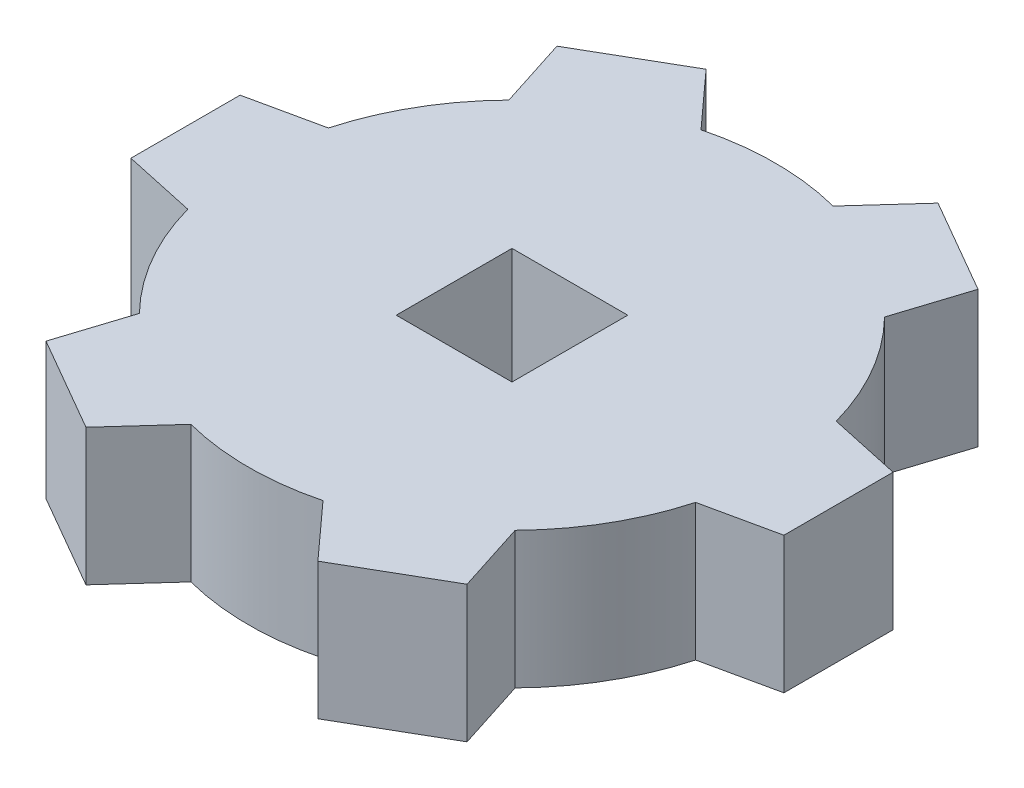
ISO-10303-21;
HEADER;
FILE_DESCRIPTION(('STEP AP214'),'2;1');
FILE_NAME('part.step','',(''),(''),'','','');
FILE_SCHEMA(('AUTOMOTIVE_DESIGN { 1 0 10303 214 1 1 1 1 }'));
ENDSEC;
DATA;
#1=APPLICATION_CONTEXT('core data for automotive mechanical design processes');
#2=APPLICATION_PROTOCOL_DEFINITION('international standard','automotive_design',2000,#1);
#3=PRODUCT_CONTEXT('',#1,'mechanical');
#4=PRODUCT('Part','Part','',(#3));
#5=PRODUCT_RELATED_PRODUCT_CATEGORY('part','',(#4));
#6=PRODUCT_DEFINITION_FORMATION('','',#4);
#7=PRODUCT_DEFINITION_CONTEXT('part definition',#1,'design');
#8=PRODUCT_DEFINITION('design','',#6,#7);
#9=PRODUCT_DEFINITION_SHAPE('','',#8);
#10=(LENGTH_UNIT() NAMED_UNIT(*) SI_UNIT(.MILLI.,.METRE.));
#11=(NAMED_UNIT(*) PLANE_ANGLE_UNIT() SI_UNIT($,.RADIAN.));
#12=(NAMED_UNIT(*) SI_UNIT($,.STERADIAN.) SOLID_ANGLE_UNIT());
#13=UNCERTAINTY_MEASURE_WITH_UNIT(LENGTH_MEASURE(1.E-05),#10,'distance_accuracy_value','');
#14=(GEOMETRIC_REPRESENTATION_CONTEXT(3) GLOBAL_UNCERTAINTY_ASSIGNED_CONTEXT((#13)) GLOBAL_UNIT_ASSIGNED_CONTEXT((#10,
#11,#12)) REPRESENTATION_CONTEXT('',''));
#15=CARTESIAN_POINT('',(0.,0.,0.));
#16=DIRECTION('',(0.,0.,1.));
#17=DIRECTION('',(1.,0.,0.));
#18=AXIS2_PLACEMENT_3D('',#15,#16,#17);
#19=CARTESIAN_POINT('',(0.,5.,0.));
#20=DIRECTION('',(0.,1.,0.));
#21=DIRECTION('',(0.,0.,1.));
#22=AXIS2_PLACEMENT_3D('',#19,#20,#21);
#23=PLANE('',#22);
#24=DIRECTION('',(0.977350986085218,0.,-0.211624785878809));
#25=VECTOR('',#24,1.);
#26=CARTESIAN_POINT('',(9.65,5.,2.5));
#27=LINE('',#26,#25);
#28=CARTESIAN_POINT('',(9.29987594348419,5.,2.57581199543059));
#29=VERTEX_POINT('',#28);
#30=CARTESIAN_POINT('',(11.9591600117319,5.,2.));
#31=VERTEX_POINT('',#30);
#32=EDGE_CURVE('E256',#29,#31,#27,.T.);
#33=ORIENTED_EDGE('',*,*,#32,.T.);
#34=DIRECTION('',(0.,0.,-1.));
#35=VECTOR('',#34,1.);
#36=CARTESIAN_POINT('',(11.9591600117319,5.,-2.));
#37=LINE('',#36,#35);
#38=CARTESIAN_POINT('',(11.9591600117319,5.,-2.));
#39=VERTEX_POINT('',#38);
#40=EDGE_CURVE('E258',#31,#39,#37,.T.);
#41=ORIENTED_EDGE('',*,*,#40,.T.);
#42=DIRECTION('',(-0.977350986085224,0.,-0.21162478587878));
#43=VECTOR('',#42,1.);
#44=CARTESIAN_POINT('',(11.9591600117319,5.,-2.));
#45=LINE('',#44,#43);
#46=CARTESIAN_POINT('',(9.29987594348419,5.,-2.57581199543059));
#47=VERTEX_POINT('',#46);
#48=EDGE_CURVE('E261',#39,#47,#45,.T.);
#49=ORIENTED_EDGE('',*,*,#48,.T.);
#50=CARTESIAN_POINT('',(0.,5.,0.));
#51=DIRECTION('',(0.,1.,0.));
#52=DIRECTION('',(0.,0.,1.));
#53=AXIS2_PLACEMENT_3D('',#50,#51,#52);
#54=CIRCLE('',#53,9.65);
#55=CARTESIAN_POINT('',(6.88065659515767,5.,-6.76602282138579));
#56=VERTEX_POINT('',#55);
#57=EDGE_CURVE('E263',#47,#56,#54,.T.);
#58=ORIENTED_EDGE('',*,*,#57,.T.);
#59=DIRECTION('',(0.305403052401118,0.,-0.952223175302975));
#60=VECTOR('',#59,1.);
#61=CARTESIAN_POINT('',(6.99006350946109,5.,-7.10714514651984));
#62=LINE('',#61,#60);
#63=CARTESIAN_POINT('',(7.71163081343484,5.,-9.35693637808287));
#64=VERTEX_POINT('',#63);
#65=EDGE_CURVE('E265',#56,#64,#62,.T.);
#66=ORIENTED_EDGE('',*,*,#65,.T.);
#67=DIRECTION('',(-0.866025403784439,0.,-0.5));
#68=VECTOR('',#67,1.);
#69=CARTESIAN_POINT('',(4.24752919829708,5.,-11.3569363780829));
#70=LINE('',#69,#68);
#71=CARTESIAN_POINT('',(4.24752919829708,5.,-11.3569363780829));
#72=VERTEX_POINT('',#71);
#73=EDGE_CURVE('E267',#64,#72,#70,.T.);
#74=ORIENTED_EDGE('',*,*,#73,.T.);
#75=DIRECTION('',(-0.671947933684077,0.,0.740598389424187));
#76=VECTOR('',#75,1.);
#77=CARTESIAN_POINT('',(4.24752919829708,5.,-11.3569363780829));
#78=LINE('',#77,#76);
#79=CARTESIAN_POINT('',(2.4192193483265,5.,-9.34183481681638));
#80=VERTEX_POINT('',#79);
#81=EDGE_CURVE('E269',#72,#80,#78,.T.);
#82=ORIENTED_EDGE('',*,*,#81,.T.);
#83=CARTESIAN_POINT('',(0.,5.,0.));
#84=DIRECTION('',(0.,1.,0.));
#85=DIRECTION('',(0.,0.,1.));
#86=AXIS2_PLACEMENT_3D('',#83,#84,#85);
#87=CIRCLE('',#86,9.65);
#88=CARTESIAN_POINT('',(-2.41921934832651,5.,-9.34183481681637));
#89=VERTEX_POINT('',#88);
#90=EDGE_CURVE('E271',#80,#89,#87,.T.);
#91=ORIENTED_EDGE('',*,*,#90,.T.);
#92=DIRECTION('',(-0.6719479336841,0.,-0.740598389424166));
#93=VECTOR('',#92,1.);
#94=CARTESIAN_POINT('',(-2.65993649053891,5.,-9.60714514651983));
#95=LINE('',#94,#93);
#96=CARTESIAN_POINT('',(-4.2475291982971,5.,-11.3569363780829));
#97=VERTEX_POINT('',#96);
#98=EDGE_CURVE('E273',#89,#97,#95,.T.);
#99=ORIENTED_EDGE('',*,*,#98,.T.);
#100=DIRECTION('',(-0.866025403784438,0.,0.5));
#101=VECTOR('',#100,1.);
#102=CARTESIAN_POINT('',(-7.71163081343485,5.,-9.35693637808286));
#103=LINE('',#102,#101);
#104=CARTESIAN_POINT('',(-7.71163081343485,5.,-9.35693637808286));
#105=VERTEX_POINT('',#104);
#106=EDGE_CURVE('E275',#97,#105,#103,.T.);
#107=ORIENTED_EDGE('',*,*,#106,.T.);
#108=DIRECTION('',(0.305403052401147,0.,0.952223175302966));
#109=VECTOR('',#108,1.);
#110=CARTESIAN_POINT('',(-7.71163081343485,5.,-9.35693637808286));
#111=LINE('',#110,#109);
#112=CARTESIAN_POINT('',(-6.88065659515768,5.,-6.76602282138578));
#113=VERTEX_POINT('',#112);
#114=EDGE_CURVE('E277',#105,#113,#111,.T.);
#115=ORIENTED_EDGE('',*,*,#114,.T.);
#116=CARTESIAN_POINT('',(0.,5.,0.));
#117=DIRECTION('',(0.,1.,0.));
#118=DIRECTION('',(0.,0.,1.));
#119=AXIS2_PLACEMENT_3D('',#116,#117,#118);
#120=CIRCLE('',#119,9.65);
#121=CARTESIAN_POINT('',(-9.29987594348418,5.,-2.5758119954306));
#122=VERTEX_POINT('',#121);
#123=EDGE_CURVE('E279',#113,#122,#120,.T.);
#124=ORIENTED_EDGE('',*,*,#123,.T.);
#125=DIRECTION('',(-0.977350986085218,0.,0.211624785878809));
#126=VECTOR('',#125,1.);
#127=CARTESIAN_POINT('',(-9.65,5.,-2.5));
#128=LINE('',#127,#126);
#129=CARTESIAN_POINT('',(-11.9591600117319,5.,-2.));
#130=VERTEX_POINT('',#129);
#131=EDGE_CURVE('E281',#122,#130,#128,.T.);
#132=ORIENTED_EDGE('',*,*,#131,.T.);
#133=DIRECTION('',(0.,0.,1.));
#134=VECTOR('',#133,1.);
#135=CARTESIAN_POINT('',(-11.9591600117319,5.,2.));
#136=LINE('',#135,#134);
#137=CARTESIAN_POINT('',(-11.9591600117319,5.,2.));
#138=VERTEX_POINT('',#137);
#139=EDGE_CURVE('E283',#130,#138,#136,.T.);
#140=ORIENTED_EDGE('',*,*,#139,.T.);
#141=DIRECTION('',(0.977350986085224,0.,0.21162478587878));
#142=VECTOR('',#141,1.);
#143=CARTESIAN_POINT('',(-11.9591600117319,5.,2.));
#144=LINE('',#143,#142);
#145=CARTESIAN_POINT('',(-9.29987594348419,5.,2.5758119954306));
#146=VERTEX_POINT('',#145);
#147=EDGE_CURVE('E285',#138,#146,#144,.T.);
#148=ORIENTED_EDGE('',*,*,#147,.T.);
#149=CARTESIAN_POINT('',(0.,5.,0.));
#150=DIRECTION('',(0.,1.,0.));
#151=DIRECTION('',(0.,0.,1.));
#152=AXIS2_PLACEMENT_3D('',#149,#150,#151);
#153=CIRCLE('',#152,9.65);
#154=CARTESIAN_POINT('',(-6.88065659515768,5.,6.76602282138578));
#155=VERTEX_POINT('',#154);
#156=EDGE_CURVE('E287',#146,#155,#153,.T.);
#157=ORIENTED_EDGE('',*,*,#156,.T.);
#158=DIRECTION('',(-0.305403052401119,0.,0.952223175302975));
#159=VECTOR('',#158,1.);
#160=CARTESIAN_POINT('',(-6.9900635094611,5.,7.10714514651984));
#161=LINE('',#160,#159);
#162=CARTESIAN_POINT('',(-7.71163081343484,5.,9.35693637808287));
#163=VERTEX_POINT('',#162);
#164=EDGE_CURVE('E289',#155,#163,#161,.T.);
#165=ORIENTED_EDGE('',*,*,#164,.T.);
#166=DIRECTION('',(0.866025403784439,0.,0.5));
#167=VECTOR('',#166,1.);
#168=CARTESIAN_POINT('',(-4.24752919829709,5.,11.3569363780829));
#169=LINE('',#168,#167);
#170=CARTESIAN_POINT('',(-4.24752919829709,5.,11.3569363780829));
#171=VERTEX_POINT('',#170);
#172=EDGE_CURVE('E291',#163,#171,#169,.T.);
#173=ORIENTED_EDGE('',*,*,#172,.T.);
#174=DIRECTION('',(0.671947933684078,0.,-0.740598389424186));
#175=VECTOR('',#174,1.);
#176=CARTESIAN_POINT('',(-4.24752919829709,5.,11.3569363780829));
#177=LINE('',#176,#175);
#178=CARTESIAN_POINT('',(-2.41921934832651,5.,9.34183481681638));
#179=VERTEX_POINT('',#178);
#180=EDGE_CURVE('E293',#171,#179,#177,.T.);
#181=ORIENTED_EDGE('',*,*,#180,.T.);
#182=CARTESIAN_POINT('',(0.,5.,0.));
#183=DIRECTION('',(0.,1.,0.));
#184=DIRECTION('',(0.,0.,1.));
#185=AXIS2_PLACEMENT_3D('',#182,#183,#184);
#186=CIRCLE('',#185,9.65);
#187=CARTESIAN_POINT('',(2.41921934832651,5.,9.34183481681638));
#188=VERTEX_POINT('',#187);
#189=EDGE_CURVE('E295',#179,#188,#186,.T.);
#190=ORIENTED_EDGE('',*,*,#189,.T.);
#191=DIRECTION('',(0.671947933684103,0.,0.740598389424163));
#192=VECTOR('',#191,1.);
#193=CARTESIAN_POINT('',(2.6599364905389,5.,9.60714514651983));
#194=LINE('',#193,#192);
#195=CARTESIAN_POINT('',(4.24752919829709,5.,11.3569363780829));
#196=VERTEX_POINT('',#195);
#197=EDGE_CURVE('E297',#188,#196,#194,.T.);
#198=ORIENTED_EDGE('',*,*,#197,.T.);
#199=DIRECTION('',(0.866025403784438,0.,-0.5));
#200=VECTOR('',#199,1.);
#201=CARTESIAN_POINT('',(7.71163081343485,5.,9.35693637808286));
#202=LINE('',#201,#200);
#203=CARTESIAN_POINT('',(7.71163081343485,5.,9.35693637808286));
#204=VERTEX_POINT('',#203);
#205=EDGE_CURVE('E299',#196,#204,#202,.T.);
#206=ORIENTED_EDGE('',*,*,#205,.T.);
#207=DIRECTION('',(-0.305403052401147,0.,-0.952223175302966));
#208=VECTOR('',#207,1.);
#209=CARTESIAN_POINT('',(7.71163081343485,5.,9.35693637808286));
#210=LINE('',#209,#208);
#211=CARTESIAN_POINT('',(6.88065659515767,5.,6.76602282138578));
#212=VERTEX_POINT('',#211);
#213=EDGE_CURVE('E301',#204,#212,#210,.T.);
#214=ORIENTED_EDGE('',*,*,#213,.T.);
#215=CARTESIAN_POINT('',(0.,5.,0.));
#216=DIRECTION('',(0.,1.,0.));
#217=DIRECTION('',(0.,0.,1.));
#218=AXIS2_PLACEMENT_3D('',#215,#216,#217);
#219=CIRCLE('',#218,9.65);
#220=EDGE_CURVE('E303',#212,#29,#219,.T.);
#221=ORIENTED_EDGE('',*,*,#220,.T.);
#222=EDGE_LOOP('',(#33,#41,#49,#58,#66,#74,#82,#91,#99,#107,#115,#124,#132,#140,#148,#157,#165,
#173,#181,#190,#198,#206,#214,#221));
#223=FACE_BOUND('',#222,.T.);
#224=DIRECTION('',(1.,0.,0.));
#225=VECTOR('',#224,1.);
#226=CARTESIAN_POINT('',(2.12,5.,2.12));
#227=LINE('',#226,#225);
#228=CARTESIAN_POINT('',(-2.12,5.,2.12));
#229=VERTEX_POINT('',#228);
#230=CARTESIAN_POINT('',(2.12,5.,2.12));
#231=VERTEX_POINT('',#230);
#232=EDGE_CURVE('E228',#229,#231,#227,.T.);
#233=ORIENTED_EDGE('',*,*,#232,.F.);
#234=DIRECTION('',(0.,0.,1.));
#235=VECTOR('',#234,1.);
#236=CARTESIAN_POINT('',(-2.12,5.,-2.12));
#237=LINE('',#236,#235);
#238=CARTESIAN_POINT('',(-2.12,5.,-2.12));
#239=VERTEX_POINT('',#238);
#240=EDGE_CURVE('E220',#239,#229,#237,.T.);
#241=ORIENTED_EDGE('',*,*,#240,.F.);
#242=DIRECTION('',(-1.,0.,0.));
#243=VECTOR('',#242,1.);
#244=CARTESIAN_POINT('',(2.12,5.,-2.12));
#245=LINE('',#244,#243);
#246=CARTESIAN_POINT('',(2.12,5.,-2.12));
#247=VERTEX_POINT('',#246);
#248=EDGE_CURVE('E242',#247,#239,#245,.T.);
#249=ORIENTED_EDGE('',*,*,#248,.F.);
#250=DIRECTION('',(0.,0.,-1.));
#251=VECTOR('',#250,1.);
#252=CARTESIAN_POINT('',(2.12,5.,-2.12));
#253=LINE('',#252,#251);
#254=EDGE_CURVE('E240',#231,#247,#253,.T.);
#255=ORIENTED_EDGE('',*,*,#254,.F.);
#256=EDGE_LOOP('',(#233,#241,#249,#255));
#257=FACE_BOUND('',#256,.T.);
#258=ADVANCED_FACE('F35',(#223,#257),#23,.T.);
#259=CARTESIAN_POINT('',(0.,0.,0.));
#260=DIRECTION('',(0.,1.,0.));
#261=DIRECTION('',(0.,0.,1.));
#262=AXIS2_PLACEMENT_3D('',#259,#260,#261);
#263=PLANE('',#262);
#264=DIRECTION('',(0.977350986085224,0.,-0.21162478587878));
#265=VECTOR('',#264,1.);
#266=CARTESIAN_POINT('',(11.9591600117319,0.,2.));
#267=LINE('',#266,#265);
#268=CARTESIAN_POINT('',(9.29987594348419,0.,2.57581199543059));
#269=VERTEX_POINT('',#268);
#270=CARTESIAN_POINT('',(11.9591600117319,0.,2.));
#271=VERTEX_POINT('',#270);
#272=EDGE_CURVE('E236',#269,#271,#267,.T.);
#273=ORIENTED_EDGE('',*,*,#272,.F.);
#274=CARTESIAN_POINT('',(0.,0.,0.));
#275=DIRECTION('',(0.,1.,0.));
#276=DIRECTION('',(0.,0.,1.));
#277=AXIS2_PLACEMENT_3D('',#274,#275,#276);
#278=CIRCLE('',#277,9.65);
#279=CARTESIAN_POINT('',(6.88065659515767,0.,6.76602282138578));
#280=VERTEX_POINT('',#279);
#281=EDGE_CURVE('E259',#280,#269,#278,.T.);
#282=ORIENTED_EDGE('',*,*,#281,.F.);
#283=DIRECTION('',(-0.305403052401119,0.,-0.952223175302975));
#284=VECTOR('',#283,1.);
#285=CARTESIAN_POINT('',(6.9900635094611,0.,7.10714514651983));
#286=LINE('',#285,#284);
#287=CARTESIAN_POINT('',(7.71163081343485,0.,9.35693637808286));
#288=VERTEX_POINT('',#287);
#289=EDGE_CURVE('E360',#288,#280,#286,.T.);
#290=ORIENTED_EDGE('',*,*,#289,.F.);
#291=DIRECTION('',(0.866025403784438,0.,-0.5));
#292=VECTOR('',#291,1.);
#293=CARTESIAN_POINT('',(7.71163081343485,0.,9.35693637808286));
#294=LINE('',#293,#292);
#295=CARTESIAN_POINT('',(4.24752919829709,0.,11.3569363780829));
#296=VERTEX_POINT('',#295);
#297=EDGE_CURVE('E357',#296,#288,#294,.T.);
#298=ORIENTED_EDGE('',*,*,#297,.F.);
#299=DIRECTION('',(0.671947933684078,0.,0.740598389424186));
#300=VECTOR('',#299,1.);
#301=CARTESIAN_POINT('',(4.24752919829709,0.,11.3569363780829));
#302=LINE('',#301,#300);
#303=CARTESIAN_POINT('',(2.41921934832651,0.,9.34183481681638));
#304=VERTEX_POINT('',#303);
#305=EDGE_CURVE('E355',#304,#296,#302,.T.);
#306=ORIENTED_EDGE('',*,*,#305,.F.);
#307=CARTESIAN_POINT('',(0.,0.,0.));
#308=DIRECTION('',(0.,1.,0.));
#309=DIRECTION('',(0.,0.,1.));
#310=AXIS2_PLACEMENT_3D('',#307,#308,#309);
#311=CIRCLE('',#310,9.65);
#312=CARTESIAN_POINT('',(-2.41921934832651,0.,9.34183481681638));
#313=VERTEX_POINT('',#312);
#314=EDGE_CURVE('E352',#313,#304,#311,.T.);
#315=ORIENTED_EDGE('',*,*,#314,.F.);
#316=DIRECTION('',(0.6719479336841,0.,-0.740598389424166));
#317=VECTOR('',#316,1.);
#318=CARTESIAN_POINT('',(-2.6599364905389,0.,9.60714514651983));
#319=LINE('',#318,#317);
#320=CARTESIAN_POINT('',(-4.24752919829709,0.,11.3569363780829));
#321=VERTEX_POINT('',#320);
#322=EDGE_CURVE('E350',#321,#313,#319,.T.);
#323=ORIENTED_EDGE('',*,*,#322,.F.);
#324=DIRECTION('',(0.866025403784439,0.,0.5));
#325=VECTOR('',#324,1.);
#326=CARTESIAN_POINT('',(-4.24752919829709,0.,11.3569363780829));
#327=LINE('',#326,#325);
#328=CARTESIAN_POINT('',(-7.71163081343484,0.,9.35693637808287));
#329=VERTEX_POINT('',#328);
#330=EDGE_CURVE('E347',#329,#321,#327,.T.);
#331=ORIENTED_EDGE('',*,*,#330,.F.);
#332=DIRECTION('',(-0.305403052401146,0.,0.952223175302966));
#333=VECTOR('',#332,1.);
#334=CARTESIAN_POINT('',(-7.71163081343484,0.,9.35693637808287));
#335=LINE('',#334,#333);
#336=CARTESIAN_POINT('',(-6.88065659515768,0.,6.76602282138578));
#337=VERTEX_POINT('',#336);
#338=EDGE_CURVE('E345',#337,#329,#335,.T.);
#339=ORIENTED_EDGE('',*,*,#338,.F.);
#340=CARTESIAN_POINT('',(0.,0.,0.));
#341=DIRECTION('',(0.,1.,0.));
#342=DIRECTION('',(0.,0.,1.));
#343=AXIS2_PLACEMENT_3D('',#340,#341,#342);
#344=CIRCLE('',#343,9.65);
#345=CARTESIAN_POINT('',(-9.29987594348419,0.,2.5758119954306));
#346=VERTEX_POINT('',#345);
#347=EDGE_CURVE('E342',#346,#337,#344,.T.);
#348=ORIENTED_EDGE('',*,*,#347,.F.);
#349=DIRECTION('',(0.977350986085218,0.,0.211624785878809));
#350=VECTOR('',#349,1.);
#351=CARTESIAN_POINT('',(-9.65,0.,2.5));
#352=LINE('',#351,#350);
#353=CARTESIAN_POINT('',(-11.9591600117319,0.,2.));
#354=VERTEX_POINT('',#353);
#355=EDGE_CURVE('E340',#354,#346,#352,.T.);
#356=ORIENTED_EDGE('',*,*,#355,.F.);
#357=DIRECTION('',(0.,0.,1.));
#358=VECTOR('',#357,1.);
#359=CARTESIAN_POINT('',(-11.9591600117319,0.,2.));
#360=LINE('',#359,#358);
#361=CARTESIAN_POINT('',(-11.9591600117319,0.,-2.));
#362=VERTEX_POINT('',#361);
#363=EDGE_CURVE('E337',#362,#354,#360,.T.);
#364=ORIENTED_EDGE('',*,*,#363,.F.);
#365=DIRECTION('',(-0.977350986085224,0.,0.21162478587878));
#366=VECTOR('',#365,1.);
#367=CARTESIAN_POINT('',(-11.9591600117319,0.,-2.));
#368=LINE('',#367,#366);
#369=CARTESIAN_POINT('',(-9.29987594348418,0.,-2.5758119954306));
#370=VERTEX_POINT('',#369);
#371=EDGE_CURVE('E335',#370,#362,#368,.T.);
#372=ORIENTED_EDGE('',*,*,#371,.F.);
#373=CARTESIAN_POINT('',(0.,0.,0.));
#374=DIRECTION('',(0.,1.,0.));
#375=DIRECTION('',(0.,0.,1.));
#376=AXIS2_PLACEMENT_3D('',#373,#374,#375);
#377=CIRCLE('',#376,9.65);
#378=CARTESIAN_POINT('',(-6.88065659515768,0.,-6.76602282138578));
#379=VERTEX_POINT('',#378);
#380=EDGE_CURVE('E332',#379,#370,#377,.T.);
#381=ORIENTED_EDGE('',*,*,#380,.F.);
#382=DIRECTION('',(0.30540305240112,0.,0.952223175302974));
#383=VECTOR('',#382,1.);
#384=CARTESIAN_POINT('',(-6.9900635094611,0.,-7.10714514651983));
#385=LINE('',#384,#383);
#386=CARTESIAN_POINT('',(-7.71163081343485,0.,-9.35693637808286));
#387=VERTEX_POINT('',#386);
#388=EDGE_CURVE('E330',#387,#379,#385,.T.);
#389=ORIENTED_EDGE('',*,*,#388,.F.);
#390=DIRECTION('',(-0.866025403784438,0.,0.5));
#391=VECTOR('',#390,1.);
#392=CARTESIAN_POINT('',(-7.71163081343485,0.,-9.35693637808286));
#393=LINE('',#392,#391);
#394=CARTESIAN_POINT('',(-4.2475291982971,0.,-11.3569363780829));
#395=VERTEX_POINT('',#394);
#396=EDGE_CURVE('E327',#395,#387,#393,.T.);
#397=ORIENTED_EDGE('',*,*,#396,.F.);
#398=DIRECTION('',(-0.671947933684078,0.,-0.740598389424185));
#399=VECTOR('',#398,1.);
#400=CARTESIAN_POINT('',(-4.2475291982971,0.,-11.3569363780829));
#401=LINE('',#400,#399);
#402=CARTESIAN_POINT('',(-2.41921934832651,0.,-9.34183481681637));
#403=VERTEX_POINT('',#402);
#404=EDGE_CURVE('E325',#403,#395,#401,.T.);
#405=ORIENTED_EDGE('',*,*,#404,.F.);
#406=CARTESIAN_POINT('',(0.,0.,0.));
#407=DIRECTION('',(0.,1.,0.));
#408=DIRECTION('',(0.,0.,1.));
#409=AXIS2_PLACEMENT_3D('',#406,#407,#408);
#410=CIRCLE('',#409,9.65);
#411=CARTESIAN_POINT('',(2.4192193483265,0.,-9.34183481681638));
#412=VERTEX_POINT('',#411);
#413=EDGE_CURVE('E322',#412,#403,#410,.T.);
#414=ORIENTED_EDGE('',*,*,#413,.F.);
#415=DIRECTION('',(-0.671947933684101,0.,0.740598389424165));
#416=VECTOR('',#415,1.);
#417=CARTESIAN_POINT('',(2.6599364905389,0.,-9.60714514651983));
#418=LINE('',#417,#416);
#419=CARTESIAN_POINT('',(4.24752919829708,0.,-11.3569363780829));
#420=VERTEX_POINT('',#419);
#421=EDGE_CURVE('E320',#420,#412,#418,.T.);
#422=ORIENTED_EDGE('',*,*,#421,.F.);
#423=DIRECTION('',(-0.866025403784439,0.,-0.5));
#424=VECTOR('',#423,1.);
#425=CARTESIAN_POINT('',(4.24752919829708,0.,-11.3569363780829));
#426=LINE('',#425,#424);
#427=CARTESIAN_POINT('',(7.71163081343484,0.,-9.35693637808287));
#428=VERTEX_POINT('',#427);
#429=EDGE_CURVE('E317',#428,#420,#426,.T.);
#430=ORIENTED_EDGE('',*,*,#429,.F.);
#431=DIRECTION('',(0.305403052401145,0.,-0.952223175302966));
#432=VECTOR('',#431,1.);
#433=CARTESIAN_POINT('',(7.71163081343484,0.,-9.35693637808287));
#434=LINE('',#433,#432);
#435=CARTESIAN_POINT('',(6.88065659515767,0.,-6.76602282138579));
#436=VERTEX_POINT('',#435);
#437=EDGE_CURVE('E315',#436,#428,#434,.T.);
#438=ORIENTED_EDGE('',*,*,#437,.F.);
#439=CARTESIAN_POINT('',(0.,0.,0.));
#440=DIRECTION('',(0.,1.,0.));
#441=DIRECTION('',(0.,0.,1.));
#442=AXIS2_PLACEMENT_3D('',#439,#440,#441);
#443=CIRCLE('',#442,9.65);
#444=CARTESIAN_POINT('',(9.29987594348419,0.,-2.57581199543059));
#445=VERTEX_POINT('',#444);
#446=EDGE_CURVE('E312',#445,#436,#443,.T.);
#447=ORIENTED_EDGE('',*,*,#446,.F.);
#448=DIRECTION('',(-0.977350986085218,0.,-0.211624785878809));
#449=VECTOR('',#448,1.);
#450=CARTESIAN_POINT('',(9.65,0.,-2.5));
#451=LINE('',#450,#449);
#452=CARTESIAN_POINT('',(11.9591600117319,0.,-2.));
#453=VERTEX_POINT('',#452);
#454=EDGE_CURVE('E310',#453,#445,#451,.T.);
#455=ORIENTED_EDGE('',*,*,#454,.F.);
#456=DIRECTION('',(0.,0.,-1.));
#457=VECTOR('',#456,1.);
#458=CARTESIAN_POINT('',(11.9591600117319,0.,-2.));
#459=LINE('',#458,#457);
#460=EDGE_CURVE('E307',#271,#453,#459,.T.);
#461=ORIENTED_EDGE('',*,*,#460,.F.);
#462=EDGE_LOOP('',(#273,#282,#290,#298,#306,#315,#323,#331,#339,#348,#356,#364,#372,#381,#389,
#397,#405,#414,#422,#430,#438,#447,#455,#461));
#463=FACE_BOUND('',#462,.T.);
#464=DIRECTION('',(0.,0.,1.));
#465=VECTOR('',#464,1.);
#466=CARTESIAN_POINT('',(-2.12,0.,-2.12));
#467=LINE('',#466,#465);
#468=CARTESIAN_POINT('',(-2.12,0.,-2.12));
#469=VERTEX_POINT('',#468);
#470=CARTESIAN_POINT('',(-2.12,0.,2.12));
#471=VERTEX_POINT('',#470);
#472=EDGE_CURVE('E58',#469,#471,#467,.T.);
#473=ORIENTED_EDGE('',*,*,#472,.T.);
#474=DIRECTION('',(1.,0.,0.));
#475=VECTOR('',#474,1.);
#476=CARTESIAN_POINT('',(2.12,0.,2.12));
#477=LINE('',#476,#475);
#478=CARTESIAN_POINT('',(2.12,0.,2.12));
#479=VERTEX_POINT('',#478);
#480=EDGE_CURVE('E235',#471,#479,#477,.T.);
#481=ORIENTED_EDGE('',*,*,#480,.T.);
#482=DIRECTION('',(0.,0.,-1.));
#483=VECTOR('',#482,1.);
#484=CARTESIAN_POINT('',(2.12,0.,-2.12));
#485=LINE('',#484,#483);
#486=CARTESIAN_POINT('',(2.12,0.,-2.12));
#487=VERTEX_POINT('',#486);
#488=EDGE_CURVE('E248',#479,#487,#485,.T.);
#489=ORIENTED_EDGE('',*,*,#488,.T.);
#490=DIRECTION('',(-1.,0.,0.));
#491=VECTOR('',#490,1.);
#492=CARTESIAN_POINT('',(2.12,0.,-2.12));
#493=LINE('',#492,#491);
#494=EDGE_CURVE('E229',#487,#469,#493,.T.);
#495=ORIENTED_EDGE('',*,*,#494,.T.);
#496=EDGE_LOOP('',(#473,#481,#489,#495));
#497=FACE_BOUND('',#496,.T.);
#498=ADVANCED_FACE('F440',(#463,#497),#263,.F.);
#499=CARTESIAN_POINT('',(11.9591600117319,5.,2.));
#500=DIRECTION('',(-0.21162478587878,0.,-0.977350986085225));
#501=DIRECTION('',(-0.977350986085225,0.,0.21162478587878));
#502=AXIS2_PLACEMENT_3D('',#499,#500,#501);
#503=PLANE('',#502);
#504=ORIENTED_EDGE('',*,*,#272,.T.);
#505=DIRECTION('',(0.,-1.,0.));
#506=VECTOR('',#505,1.);
#507=CARTESIAN_POINT('',(11.9591600117319,5.,2.));
#508=LINE('',#507,#506);
#509=EDGE_CURVE('E11',#31,#271,#508,.T.);
#510=ORIENTED_EDGE('',*,*,#509,.F.);
#511=ORIENTED_EDGE('',*,*,#32,.F.);
#512=DIRECTION('',(0.,-1.,0.));
#513=VECTOR('',#512,1.);
#514=CARTESIAN_POINT('',(9.29987594348419,5.,2.57581199543059));
#515=LINE('',#514,#513);
#516=EDGE_CURVE('E305',#29,#269,#515,.T.);
#517=ORIENTED_EDGE('',*,*,#516,.T.);
#518=EDGE_LOOP('',(#504,#510,#511,#517));
#519=FACE_BOUND('',#518,.T.);
#520=ADVANCED_FACE('F37',(#519),#503,.F.);
#521=CARTESIAN_POINT('',(11.9591600117319,5.,-2.));
#522=DIRECTION('',(-1.,0.,0.));
#523=DIRECTION('',(0.,0.,1.));
#524=AXIS2_PLACEMENT_3D('',#521,#522,#523);
#525=PLANE('',#524);
#526=ORIENTED_EDGE('',*,*,#460,.T.);
#527=DIRECTION('',(0.,-1.,0.));
#528=VECTOR('',#527,1.);
#529=CARTESIAN_POINT('',(11.9591600117319,5.,-2.));
#530=LINE('',#529,#528);
#531=EDGE_CURVE('E43',#39,#453,#530,.T.);
#532=ORIENTED_EDGE('',*,*,#531,.F.);
#533=ORIENTED_EDGE('',*,*,#40,.F.);
#534=ORIENTED_EDGE('',*,*,#509,.T.);
#535=EDGE_LOOP('',(#526,#532,#533,#534));
#536=FACE_BOUND('',#535,.T.);
#537=ADVANCED_FACE('F436',(#536),#525,.F.);
#538=CARTESIAN_POINT('',(9.65,5.,-2.5));
#539=DIRECTION('',(-0.211624785878809,0.,0.977350986085218));
#540=DIRECTION('',(0.977350986085218,0.,0.211624785878809));
#541=AXIS2_PLACEMENT_3D('',#538,#539,#540);
#542=PLANE('',#541);
#543=ORIENTED_EDGE('',*,*,#454,.T.);
#544=DIRECTION('',(0.,-1.,0.));
#545=VECTOR('',#544,1.);
#546=CARTESIAN_POINT('',(9.29987594348419,5.,-2.57581199543059));
#547=LINE('',#546,#545);
#548=EDGE_CURVE('E426',#47,#445,#547,.T.);
#549=ORIENTED_EDGE('',*,*,#548,.F.);
#550=ORIENTED_EDGE('',*,*,#48,.F.);
#551=ORIENTED_EDGE('',*,*,#531,.T.);
#552=EDGE_LOOP('',(#543,#549,#550,#551));
#553=FACE_BOUND('',#552,.T.);
#554=ADVANCED_FACE('F432',(#553),#542,.F.);
#555=CARTESIAN_POINT('',(0.,5.,0.));
#556=DIRECTION('',(0.,-1.,0.));
#557=DIRECTION('',(0.,0.,-1.));
#558=AXIS2_PLACEMENT_3D('',#555,#556,#557);
#559=CYLINDRICAL_SURFACE('',#558,9.65);
#560=ORIENTED_EDGE('',*,*,#446,.T.);
#561=DIRECTION('',(0.,-1.,0.));
#562=VECTOR('',#561,1.);
#563=CARTESIAN_POINT('',(6.88065659515767,5.,-6.76602282138579));
#564=LINE('',#563,#562);
#565=EDGE_CURVE('E423',#56,#436,#564,.T.);
#566=ORIENTED_EDGE('',*,*,#565,.F.);
#567=ORIENTED_EDGE('',*,*,#57,.F.);
#568=ORIENTED_EDGE('',*,*,#548,.T.);
#569=EDGE_LOOP('',(#560,#566,#567,#568));
#570=FACE_BOUND('',#569,.T.);
#571=ADVANCED_FACE('F447',(#570),#559,.T.);
#572=CARTESIAN_POINT('',(7.71163081343484,5.,-9.35693637808287));
#573=DIRECTION('',(-0.952223175302966,0.,-0.305403052401145));
#574=DIRECTION('',(-0.305403052401145,0.,0.952223175302966));
#575=AXIS2_PLACEMENT_3D('',#572,#573,#574);
#576=PLANE('',#575);
#577=ORIENTED_EDGE('',*,*,#437,.T.);
#578=DIRECTION('',(0.,-1.,0.));
#579=VECTOR('',#578,1.);
#580=CARTESIAN_POINT('',(7.71163081343484,5.,-9.35693637808287));
#581=LINE('',#580,#579);
#582=EDGE_CURVE('E420',#64,#428,#581,.T.);
#583=ORIENTED_EDGE('',*,*,#582,.F.);
#584=ORIENTED_EDGE('',*,*,#65,.F.);
#585=ORIENTED_EDGE('',*,*,#565,.T.);
#586=EDGE_LOOP('',(#577,#583,#584,#585));
#587=FACE_BOUND('',#586,.T.);
#588=ADVANCED_FACE('F451',(#587),#576,.F.);
#589=CARTESIAN_POINT('',(4.24752919829708,5.,-11.3569363780829));
#590=DIRECTION('',(-0.5,0.,0.866025403784439));
#591=DIRECTION('',(0.866025403784439,0.,0.5));
#592=AXIS2_PLACEMENT_3D('',#589,#590,#591);
#593=PLANE('',#592);
#594=ORIENTED_EDGE('',*,*,#429,.T.);
#595=DIRECTION('',(0.,-1.,0.));
#596=VECTOR('',#595,1.);
#597=CARTESIAN_POINT('',(4.24752919829708,5.,-11.3569363780829));
#598=LINE('',#597,#596);
#599=EDGE_CURVE('E417',#72,#420,#598,.T.);
#600=ORIENTED_EDGE('',*,*,#599,.F.);
#601=ORIENTED_EDGE('',*,*,#73,.F.);
#602=ORIENTED_EDGE('',*,*,#582,.T.);
#603=EDGE_LOOP('',(#594,#600,#601,#602));
#604=FACE_BOUND('',#603,.T.);
#605=ADVANCED_FACE('F539',(#604),#593,.F.);
#606=CARTESIAN_POINT('',(2.6599364905389,5.,-9.60714514651983));
#607=DIRECTION('',(0.740598389424165,0.,0.671947933684101));
#608=DIRECTION('',(0.671947933684101,0.,-0.740598389424165));
#609=AXIS2_PLACEMENT_3D('',#606,#607,#608);
#610=PLANE('',#609);
#611=ORIENTED_EDGE('',*,*,#421,.T.);
#612=DIRECTION('',(0.,-1.,0.));
#613=VECTOR('',#612,1.);
#614=CARTESIAN_POINT('',(2.4192193483265,5.,-9.34183481681638));
#615=LINE('',#614,#613);
#616=EDGE_CURVE('E414',#80,#412,#615,.T.);
#617=ORIENTED_EDGE('',*,*,#616,.F.);
#618=ORIENTED_EDGE('',*,*,#81,.F.);
#619=ORIENTED_EDGE('',*,*,#599,.T.);
#620=EDGE_LOOP('',(#611,#617,#618,#619));
#621=FACE_BOUND('',#620,.T.);
#622=ADVANCED_FACE('F537',(#621),#610,.F.);
#623=CARTESIAN_POINT('',(0.,5.,0.));
#624=DIRECTION('',(0.,-1.,0.));
#625=DIRECTION('',(0.,0.,-1.));
#626=AXIS2_PLACEMENT_3D('',#623,#624,#625);
#627=CYLINDRICAL_SURFACE('',#626,9.65);
#628=ORIENTED_EDGE('',*,*,#413,.T.);
#629=DIRECTION('',(0.,-1.,0.));
#630=VECTOR('',#629,1.);
#631=CARTESIAN_POINT('',(-2.41921934832651,5.,-9.34183481681637));
#632=LINE('',#631,#630);
#633=EDGE_CURVE('E411',#89,#403,#632,.T.);
#634=ORIENTED_EDGE('',*,*,#633,.F.);
#635=ORIENTED_EDGE('',*,*,#90,.F.);
#636=ORIENTED_EDGE('',*,*,#616,.T.);
#637=EDGE_LOOP('',(#628,#634,#635,#636));
#638=FACE_BOUND('',#637,.T.);
#639=ADVANCED_FACE('F532',(#638),#627,.T.);
#640=CARTESIAN_POINT('',(-4.2475291982971,5.,-11.3569363780829));
#641=DIRECTION('',(-0.740598389424185,0.,0.671947933684078));
#642=DIRECTION('',(0.671947933684079,0.,0.740598389424185));
#643=AXIS2_PLACEMENT_3D('',#640,#641,#642);
#644=PLANE('',#643);
#645=ORIENTED_EDGE('',*,*,#404,.T.);
#646=DIRECTION('',(0.,-1.,0.));
#647=VECTOR('',#646,1.);
#648=CARTESIAN_POINT('',(-4.2475291982971,5.,-11.3569363780829));
#649=LINE('',#648,#647);
#650=EDGE_CURVE('E408',#97,#395,#649,.T.);
#651=ORIENTED_EDGE('',*,*,#650,.F.);
#652=ORIENTED_EDGE('',*,*,#98,.F.);
#653=ORIENTED_EDGE('',*,*,#633,.T.);
#654=EDGE_LOOP('',(#645,#651,#652,#653));
#655=FACE_BOUND('',#654,.T.);
#656=ADVANCED_FACE('F528',(#655),#644,.F.);
#657=CARTESIAN_POINT('',(-7.71163081343485,5.,-9.35693637808286));
#658=DIRECTION('',(0.5,0.,0.866025403784438));
#659=DIRECTION('',(0.866025403784438,0.,-0.5));
#660=AXIS2_PLACEMENT_3D('',#657,#658,#659);
#661=PLANE('',#660);
#662=ORIENTED_EDGE('',*,*,#396,.T.);
#663=DIRECTION('',(0.,-1.,0.));
#664=VECTOR('',#663,1.);
#665=CARTESIAN_POINT('',(-7.71163081343485,5.,-9.35693637808286));
#666=LINE('',#665,#664);
#667=EDGE_CURVE('E405',#105,#387,#666,.T.);
#668=ORIENTED_EDGE('',*,*,#667,.F.);
#669=ORIENTED_EDGE('',*,*,#106,.F.);
#670=ORIENTED_EDGE('',*,*,#650,.T.);
#671=EDGE_LOOP('',(#662,#668,#669,#670));
#672=FACE_BOUND('',#671,.T.);
#673=ADVANCED_FACE('F523',(#672),#661,.F.);
#674=CARTESIAN_POINT('',(-6.9900635094611,5.,-7.10714514651983));
#675=DIRECTION('',(0.952223175302974,0.,-0.30540305240112));
#676=DIRECTION('',(-0.30540305240112,0.,-0.952223175302974));
#677=AXIS2_PLACEMENT_3D('',#674,#675,#676);
#678=PLANE('',#677);
#679=ORIENTED_EDGE('',*,*,#388,.T.);
#680=DIRECTION('',(0.,-1.,0.));
#681=VECTOR('',#680,1.);
#682=CARTESIAN_POINT('',(-6.88065659515768,5.,-6.76602282138578));
#683=LINE('',#682,#681);
#684=EDGE_CURVE('E402',#113,#379,#683,.T.);
#685=ORIENTED_EDGE('',*,*,#684,.F.);
#686=ORIENTED_EDGE('',*,*,#114,.F.);
#687=ORIENTED_EDGE('',*,*,#667,.T.);
#688=EDGE_LOOP('',(#679,#685,#686,#687));
#689=FACE_BOUND('',#688,.T.);
#690=ADVANCED_FACE('F519',(#689),#678,.F.);
#691=CARTESIAN_POINT('',(0.,5.,0.));
#692=DIRECTION('',(0.,-1.,0.));
#693=DIRECTION('',(0.,0.,-1.));
#694=AXIS2_PLACEMENT_3D('',#691,#692,#693);
#695=CYLINDRICAL_SURFACE('',#694,9.65);
#696=ORIENTED_EDGE('',*,*,#380,.T.);
#697=DIRECTION('',(0.,-1.,0.));
#698=VECTOR('',#697,1.);
#699=CARTESIAN_POINT('',(-9.29987594348418,5.,-2.5758119954306));
#700=LINE('',#699,#698);
#701=EDGE_CURVE('E399',#122,#370,#700,.T.);
#702=ORIENTED_EDGE('',*,*,#701,.F.);
#703=ORIENTED_EDGE('',*,*,#123,.F.);
#704=ORIENTED_EDGE('',*,*,#684,.T.);
#705=EDGE_LOOP('',(#696,#702,#703,#704));
#706=FACE_BOUND('',#705,.T.);
#707=ADVANCED_FACE('F514',(#706),#695,.T.);
#708=CARTESIAN_POINT('',(-11.9591600117319,5.,-2.));
#709=DIRECTION('',(0.21162478587878,0.,0.977350986085225));
#710=DIRECTION('',(0.977350986085225,0.,-0.21162478587878));
#711=AXIS2_PLACEMENT_3D('',#708,#709,#710);
#712=PLANE('',#711);
#713=ORIENTED_EDGE('',*,*,#371,.T.);
#714=DIRECTION('',(0.,-1.,0.));
#715=VECTOR('',#714,1.);
#716=CARTESIAN_POINT('',(-11.9591600117319,5.,-2.));
#717=LINE('',#716,#715);
#718=EDGE_CURVE('E396',#130,#362,#717,.T.);
#719=ORIENTED_EDGE('',*,*,#718,.F.);
#720=ORIENTED_EDGE('',*,*,#131,.F.);
#721=ORIENTED_EDGE('',*,*,#701,.T.);
#722=EDGE_LOOP('',(#713,#719,#720,#721));
#723=FACE_BOUND('',#722,.T.);
#724=ADVANCED_FACE('F510',(#723),#712,.F.);
#725=CARTESIAN_POINT('',(-11.9591600117319,5.,2.));
#726=DIRECTION('',(1.,0.,0.));
#727=DIRECTION('',(0.,0.,-1.));
#728=AXIS2_PLACEMENT_3D('',#725,#726,#727);
#729=PLANE('',#728);
#730=ORIENTED_EDGE('',*,*,#363,.T.);
#731=DIRECTION('',(0.,-1.,0.));
#732=VECTOR('',#731,1.);
#733=CARTESIAN_POINT('',(-11.9591600117319,5.,2.));
#734=LINE('',#733,#732);
#735=EDGE_CURVE('E393',#138,#354,#734,.T.);
#736=ORIENTED_EDGE('',*,*,#735,.F.);
#737=ORIENTED_EDGE('',*,*,#139,.F.);
#738=ORIENTED_EDGE('',*,*,#718,.T.);
#739=EDGE_LOOP('',(#730,#736,#737,#738));
#740=FACE_BOUND('',#739,.T.);
#741=ADVANCED_FACE('F505',(#740),#729,.F.);
#742=CARTESIAN_POINT('',(-9.65,5.,2.5));
#743=DIRECTION('',(0.211624785878809,0.,-0.977350986085218));
#744=DIRECTION('',(-0.977350986085218,0.,-0.211624785878809));
#745=AXIS2_PLACEMENT_3D('',#742,#743,#744);
#746=PLANE('',#745);
#747=ORIENTED_EDGE('',*,*,#355,.T.);
#748=DIRECTION('',(0.,-1.,0.));
#749=VECTOR('',#748,1.);
#750=CARTESIAN_POINT('',(-9.29987594348419,5.,2.5758119954306));
#751=LINE('',#750,#749);
#752=EDGE_CURVE('E390',#146,#346,#751,.T.);
#753=ORIENTED_EDGE('',*,*,#752,.F.);
#754=ORIENTED_EDGE('',*,*,#147,.F.);
#755=ORIENTED_EDGE('',*,*,#735,.T.);
#756=EDGE_LOOP('',(#747,#753,#754,#755));
#757=FACE_BOUND('',#756,.T.);
#758=ADVANCED_FACE('F501',(#757),#746,.F.);
#759=CARTESIAN_POINT('',(0.,5.,0.));
#760=DIRECTION('',(0.,-1.,0.));
#761=DIRECTION('',(0.,0.,-1.));
#762=AXIS2_PLACEMENT_3D('',#759,#760,#761);
#763=CYLINDRICAL_SURFACE('',#762,9.65);
#764=ORIENTED_EDGE('',*,*,#347,.T.);
#765=DIRECTION('',(0.,-1.,0.));
#766=VECTOR('',#765,1.);
#767=CARTESIAN_POINT('',(-6.88065659515768,5.,6.76602282138578));
#768=LINE('',#767,#766);
#769=EDGE_CURVE('E387',#155,#337,#768,.T.);
#770=ORIENTED_EDGE('',*,*,#769,.F.);
#771=ORIENTED_EDGE('',*,*,#156,.F.);
#772=ORIENTED_EDGE('',*,*,#752,.T.);
#773=EDGE_LOOP('',(#764,#770,#771,#772));
#774=FACE_BOUND('',#773,.T.);
#775=ADVANCED_FACE('F496',(#774),#763,.T.);
#776=CARTESIAN_POINT('',(-7.71163081343484,5.,9.35693637808287));
#777=DIRECTION('',(0.952223175302966,0.,0.305403052401146));
#778=DIRECTION('',(0.305403052401146,0.,-0.952223175302966));
#779=AXIS2_PLACEMENT_3D('',#776,#777,#778);
#780=PLANE('',#779);
#781=ORIENTED_EDGE('',*,*,#338,.T.);
#782=DIRECTION('',(0.,-1.,0.));
#783=VECTOR('',#782,1.);
#784=CARTESIAN_POINT('',(-7.71163081343484,5.,9.35693637808287));
#785=LINE('',#784,#783);
#786=EDGE_CURVE('E384',#163,#329,#785,.T.);
#787=ORIENTED_EDGE('',*,*,#786,.F.);
#788=ORIENTED_EDGE('',*,*,#164,.F.);
#789=ORIENTED_EDGE('',*,*,#769,.T.);
#790=EDGE_LOOP('',(#781,#787,#788,#789));
#791=FACE_BOUND('',#790,.T.);
#792=ADVANCED_FACE('F492',(#791),#780,.F.);
#793=CARTESIAN_POINT('',(-4.24752919829709,5.,11.3569363780829));
#794=DIRECTION('',(0.5,0.,-0.866025403784439));
#795=DIRECTION('',(-0.866025403784439,0.,-0.5));
#796=AXIS2_PLACEMENT_3D('',#793,#794,#795);
#797=PLANE('',#796);
#798=ORIENTED_EDGE('',*,*,#330,.T.);
#799=DIRECTION('',(0.,-1.,0.));
#800=VECTOR('',#799,1.);
#801=CARTESIAN_POINT('',(-4.24752919829709,5.,11.3569363780829));
#802=LINE('',#801,#800);
#803=EDGE_CURVE('E381',#171,#321,#802,.T.);
#804=ORIENTED_EDGE('',*,*,#803,.F.);
#805=ORIENTED_EDGE('',*,*,#172,.F.);
#806=ORIENTED_EDGE('',*,*,#786,.T.);
#807=EDGE_LOOP('',(#798,#804,#805,#806));
#808=FACE_BOUND('',#807,.T.);
#809=ADVANCED_FACE('F487',(#808),#797,.F.);
#810=CARTESIAN_POINT('',(-2.6599364905389,5.,9.60714514651983));
#811=DIRECTION('',(-0.740598389424166,0.,-0.6719479336841));
#812=DIRECTION('',(-0.6719479336841,0.,0.740598389424166));
#813=AXIS2_PLACEMENT_3D('',#810,#811,#812);
#814=PLANE('',#813);
#815=ORIENTED_EDGE('',*,*,#322,.T.);
#816=DIRECTION('',(0.,-1.,0.));
#817=VECTOR('',#816,1.);
#818=CARTESIAN_POINT('',(-2.41921934832651,5.,9.34183481681638));
#819=LINE('',#818,#817);
#820=EDGE_CURVE('E378',#179,#313,#819,.T.);
#821=ORIENTED_EDGE('',*,*,#820,.F.);
#822=ORIENTED_EDGE('',*,*,#180,.F.);
#823=ORIENTED_EDGE('',*,*,#803,.T.);
#824=EDGE_LOOP('',(#815,#821,#822,#823));
#825=FACE_BOUND('',#824,.T.);
#826=ADVANCED_FACE('F483',(#825),#814,.F.);
#827=CARTESIAN_POINT('',(0.,5.,0.));
#828=DIRECTION('',(0.,-1.,0.));
#829=DIRECTION('',(0.,0.,-1.));
#830=AXIS2_PLACEMENT_3D('',#827,#828,#829);
#831=CYLINDRICAL_SURFACE('',#830,9.65);
#832=ORIENTED_EDGE('',*,*,#314,.T.);
#833=DIRECTION('',(0.,-1.,0.));
#834=VECTOR('',#833,1.);
#835=CARTESIAN_POINT('',(2.41921934832651,5.,9.34183481681638));
#836=LINE('',#835,#834);
#837=EDGE_CURVE('E375',#188,#304,#836,.T.);
#838=ORIENTED_EDGE('',*,*,#837,.F.);
#839=ORIENTED_EDGE('',*,*,#189,.F.);
#840=ORIENTED_EDGE('',*,*,#820,.T.);
#841=EDGE_LOOP('',(#832,#838,#839,#840));
#842=FACE_BOUND('',#841,.T.);
#843=ADVANCED_FACE('F479',(#842),#831,.T.);
#844=CARTESIAN_POINT('',(4.24752919829709,5.,11.3569363780829));
#845=DIRECTION('',(0.740598389424186,0.,-0.671947933684078));
#846=DIRECTION('',(-0.671947933684078,0.,-0.740598389424186));
#847=AXIS2_PLACEMENT_3D('',#844,#845,#846);
#848=PLANE('',#847);
#849=ORIENTED_EDGE('',*,*,#305,.T.);
#850=DIRECTION('',(0.,-1.,0.));
#851=VECTOR('',#850,1.);
#852=CARTESIAN_POINT('',(4.24752919829709,5.,11.3569363780829));
#853=LINE('',#852,#851);
#854=EDGE_CURVE('E372',#196,#296,#853,.T.);
#855=ORIENTED_EDGE('',*,*,#854,.F.);
#856=ORIENTED_EDGE('',*,*,#197,.F.);
#857=ORIENTED_EDGE('',*,*,#837,.T.);
#858=EDGE_LOOP('',(#849,#855,#856,#857));
#859=FACE_BOUND('',#858,.T.);
#860=ADVANCED_FACE('F476',(#859),#848,.F.);
#861=CARTESIAN_POINT('',(7.71163081343485,5.,9.35693637808286));
#862=DIRECTION('',(-0.5,0.,-0.866025403784438));
#863=DIRECTION('',(-0.866025403784438,0.,0.5));
#864=AXIS2_PLACEMENT_3D('',#861,#862,#863);
#865=PLANE('',#864);
#866=ORIENTED_EDGE('',*,*,#297,.T.);
#867=DIRECTION('',(0.,-1.,0.));
#868=VECTOR('',#867,1.);
#869=CARTESIAN_POINT('',(7.71163081343485,5.,9.35693637808286));
#870=LINE('',#869,#868);
#871=EDGE_CURVE('E369',#204,#288,#870,.T.);
#872=ORIENTED_EDGE('',*,*,#871,.F.);
#873=ORIENTED_EDGE('',*,*,#205,.F.);
#874=ORIENTED_EDGE('',*,*,#854,.T.);
#875=EDGE_LOOP('',(#866,#872,#873,#874));
#876=FACE_BOUND('',#875,.T.);
#877=ADVANCED_FACE('F467',(#876),#865,.F.);
#878=CARTESIAN_POINT('',(6.9900635094611,5.,7.10714514651983));
#879=DIRECTION('',(-0.952223175302975,0.,0.305403052401119));
#880=DIRECTION('',(0.305403052401119,0.,0.952223175302975));
#881=AXIS2_PLACEMENT_3D('',#878,#879,#880);
#882=PLANE('',#881);
#883=ORIENTED_EDGE('',*,*,#289,.T.);
#884=DIRECTION('',(0.,-1.,0.));
#885=VECTOR('',#884,1.);
#886=CARTESIAN_POINT('',(6.88065659515767,5.,6.76602282138578));
#887=LINE('',#886,#885);
#888=EDGE_CURVE('E366',#212,#280,#887,.T.);
#889=ORIENTED_EDGE('',*,*,#888,.F.);
#890=ORIENTED_EDGE('',*,*,#213,.F.);
#891=ORIENTED_EDGE('',*,*,#871,.T.);
#892=EDGE_LOOP('',(#883,#889,#890,#891));
#893=FACE_BOUND('',#892,.T.);
#894=ADVANCED_FACE('F471',(#893),#882,.F.);
#895=CARTESIAN_POINT('',(0.,5.,0.));
#896=DIRECTION('',(0.,-1.,0.));
#897=DIRECTION('',(0.,0.,-1.));
#898=AXIS2_PLACEMENT_3D('',#895,#896,#897);
#899=CYLINDRICAL_SURFACE('',#898,9.65);
#900=ORIENTED_EDGE('',*,*,#281,.T.);
#901=ORIENTED_EDGE('',*,*,#516,.F.);
#902=ORIENTED_EDGE('',*,*,#220,.F.);
#903=ORIENTED_EDGE('',*,*,#888,.T.);
#904=EDGE_LOOP('',(#900,#901,#902,#903));
#905=FACE_BOUND('',#904,.T.);
#906=ADVANCED_FACE('F461',(#905),#899,.T.);
#907=CARTESIAN_POINT('',(-2.12,5.,-2.12));
#908=DIRECTION('',(1.,0.,0.));
#909=DIRECTION('',(0.,0.,-1.));
#910=AXIS2_PLACEMENT_3D('',#907,#908,#909);
#911=PLANE('',#910);
#912=ORIENTED_EDGE('',*,*,#472,.F.);
#913=DIRECTION('',(0.,-1.,0.));
#914=VECTOR('',#913,1.);
#915=CARTESIAN_POINT('',(-2.12,5.,-2.12));
#916=LINE('',#915,#914);
#917=EDGE_CURVE('E224',#239,#469,#916,.T.);
#918=ORIENTED_EDGE('',*,*,#917,.F.);
#919=ORIENTED_EDGE('',*,*,#240,.T.);
#920=DIRECTION('',(0.,-1.,0.));
#921=VECTOR('',#920,1.);
#922=CARTESIAN_POINT('',(-2.12,5.,2.12));
#923=LINE('',#922,#921);
#924=EDGE_CURVE('E223',#229,#471,#923,.T.);
#925=ORIENTED_EDGE('',*,*,#924,.T.);
#926=EDGE_LOOP('',(#912,#918,#919,#925));
#927=FACE_BOUND('',#926,.T.);
#928=ADVANCED_FACE('F222',(#927),#911,.T.);
#929=CARTESIAN_POINT('',(2.12,5.,2.12));
#930=DIRECTION('',(0.,0.,-1.));
#931=DIRECTION('',(-1.,0.,0.));
#932=AXIS2_PLACEMENT_3D('',#929,#930,#931);
#933=PLANE('',#932);
#934=ORIENTED_EDGE('',*,*,#480,.F.);
#935=ORIENTED_EDGE('',*,*,#924,.F.);
#936=ORIENTED_EDGE('',*,*,#232,.T.);
#937=DIRECTION('',(0.,-1.,0.));
#938=VECTOR('',#937,1.);
#939=CARTESIAN_POINT('',(2.12,5.,2.12));
#940=LINE('',#939,#938);
#941=EDGE_CURVE('E237',#231,#479,#940,.T.);
#942=ORIENTED_EDGE('',*,*,#941,.T.);
#943=EDGE_LOOP('',(#934,#935,#936,#942));
#944=FACE_BOUND('',#943,.T.);
#945=ADVANCED_FACE('F232',(#944),#933,.T.);
#946=CARTESIAN_POINT('',(2.12,5.,-2.12));
#947=DIRECTION('',(-1.,0.,0.));
#948=DIRECTION('',(0.,0.,1.));
#949=AXIS2_PLACEMENT_3D('',#946,#947,#948);
#950=PLANE('',#949);
#951=ORIENTED_EDGE('',*,*,#488,.F.);
#952=ORIENTED_EDGE('',*,*,#941,.F.);
#953=ORIENTED_EDGE('',*,*,#254,.T.);
#954=DIRECTION('',(0.,-1.,0.));
#955=VECTOR('',#954,1.);
#956=CARTESIAN_POINT('',(2.12,5.,-2.12));
#957=LINE('',#956,#955);
#958=EDGE_CURVE('E50',#247,#487,#957,.T.);
#959=ORIENTED_EDGE('',*,*,#958,.T.);
#960=EDGE_LOOP('',(#951,#952,#953,#959));
#961=FACE_BOUND('',#960,.T.);
#962=ADVANCED_FACE('F669',(#961),#950,.T.);
#963=CARTESIAN_POINT('',(2.12,5.,-2.12));
#964=DIRECTION('',(0.,0.,1.));
#965=DIRECTION('',(1.,0.,0.));
#966=AXIS2_PLACEMENT_3D('',#963,#964,#965);
#967=PLANE('',#966);
#968=ORIENTED_EDGE('',*,*,#494,.F.);
#969=ORIENTED_EDGE('',*,*,#958,.F.);
#970=ORIENTED_EDGE('',*,*,#248,.T.);
#971=ORIENTED_EDGE('',*,*,#917,.T.);
#972=EDGE_LOOP('',(#968,#969,#970,#971));
#973=FACE_BOUND('',#972,.T.);
#974=ADVANCED_FACE('F675',(#973),#967,.T.);
#975=CLOSED_SHELL('',(#258,#498,#520,#537,#554,#571,#588,#605,#622,#639,#656,#673,#690,#707,
#724,#741,#758,#775,#792,#809,#826,#843,#860,#877,#894,#906,#928,#945,#962,#974));
#976=MANIFOLD_SOLID_BREP('B2',#975);
#977=ADVANCED_BREP_SHAPE_REPRESENTATION('',(#18,#976),#14);
#978=SHAPE_DEFINITION_REPRESENTATION(#9,#977);
ENDSEC;
END-ISO-10303-21;
